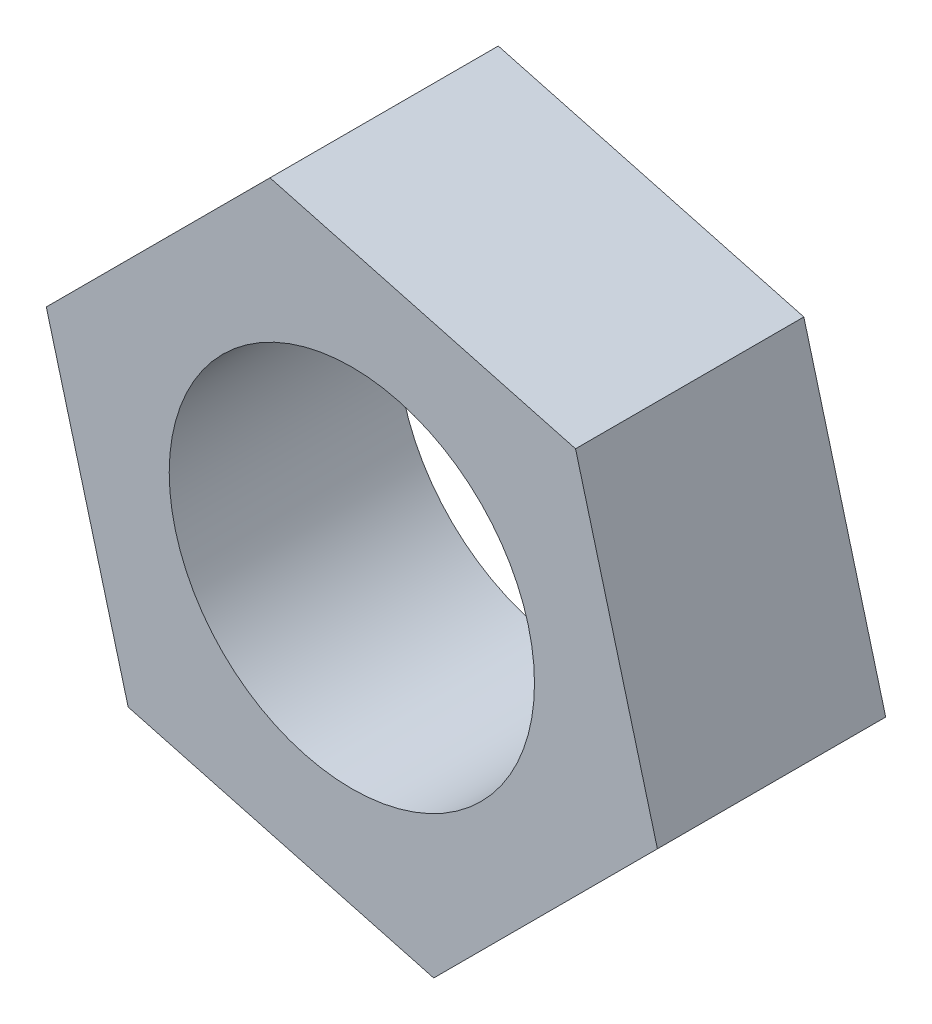
ISO-10303-21;
HEADER;
FILE_DESCRIPTION(('STEP AP214'),'2;1');
FILE_NAME('part.step','',(''),(''),'','','');
FILE_SCHEMA(('AUTOMOTIVE_DESIGN { 1 0 10303 214 1 1 1 1 }'));
ENDSEC;
DATA;
#1=APPLICATION_CONTEXT('core data for automotive mechanical design processes');
#2=APPLICATION_PROTOCOL_DEFINITION('international standard','automotive_design',2000,#1);
#3=PRODUCT_CONTEXT('',#1,'mechanical');
#4=PRODUCT('Part','Part','',(#3));
#5=PRODUCT_RELATED_PRODUCT_CATEGORY('part','',(#4));
#6=PRODUCT_DEFINITION_FORMATION('','',#4);
#7=PRODUCT_DEFINITION_CONTEXT('part definition',#1,'design');
#8=PRODUCT_DEFINITION('design','',#6,#7);
#9=PRODUCT_DEFINITION_SHAPE('','',#8);
#10=(LENGTH_UNIT() NAMED_UNIT(*) SI_UNIT(.MILLI.,.METRE.));
#11=(NAMED_UNIT(*) PLANE_ANGLE_UNIT() SI_UNIT($,.RADIAN.));
#12=(NAMED_UNIT(*) SI_UNIT($,.STERADIAN.) SOLID_ANGLE_UNIT());
#13=UNCERTAINTY_MEASURE_WITH_UNIT(LENGTH_MEASURE(1.E-05),#10,'distance_accuracy_value','');
#14=(GEOMETRIC_REPRESENTATION_CONTEXT(3) GLOBAL_UNCERTAINTY_ASSIGNED_CONTEXT((#13)) GLOBAL_UNIT_ASSIGNED_CONTEXT((#10,
#11,#12)) REPRESENTATION_CONTEXT('',''));
#15=CARTESIAN_POINT('',(0.,0.,0.));
#16=DIRECTION('',(0.,0.,1.));
#17=DIRECTION('',(1.,0.,0.));
#18=AXIS2_PLACEMENT_3D('',#15,#16,#17);
#19=CARTESIAN_POINT('',(0.,0.,5.));
#20=DIRECTION('',(0.,0.,1.));
#21=DIRECTION('',(1.,0.,0.));
#22=AXIS2_PLACEMENT_3D('',#19,#20,#21);
#23=PLANE('',#22);
#24=CARTESIAN_POINT('',(0.,0.,5.));
#25=DIRECTION('',(0.,0.,1.));
#26=DIRECTION('',(1.,0.,0.));
#27=AXIS2_PLACEMENT_3D('',#24,#25,#26);
#28=CIRCLE('',#27,4.);
#29=CARTESIAN_POINT('',(4.,0.,5.));
#30=VERTEX_POINT('',#29);
#31=EDGE_CURVE('E139',#30,#30,#28,.T.);
#32=ORIENTED_EDGE('',*,*,#31,.F.);
#33=EDGE_LOOP('',(#32));
#34=FACE_BOUND('',#33,.T.);
#35=DIRECTION('',(0.70711430388456,0.707099258408503,0.));
#36=VECTOR('',#35,1.);
#37=CARTESIAN_POINT('',(6.69211135256622,-1.79322214017613,5.));
#38=LINE('',#37,#36);
#39=CARTESIAN_POINT('',(1.79307974826223,-6.6921495063643,5.));
#40=VERTEX_POINT('',#39);
#41=CARTESIAN_POINT('',(6.69211135256622,-1.79322214017613,5.));
#42=VERTEX_POINT('',#41);
#43=EDGE_CURVE('E126',#40,#42,#38,.T.);
#44=ORIENTED_EDGE('',*,*,#43,.T.);
#45=DIRECTION('',(-0.25880876883662,0.96592857974763,0.));
#46=VECTOR('',#45,1.);
#47=CARTESIAN_POINT('',(4.89903160430447,4.89892736618804,5.));
#48=LINE('',#47,#46);
#49=CARTESIAN_POINT('',(4.89903160430447,4.89892736618804,5.));
#50=VERTEX_POINT('',#49);
#51=EDGE_CURVE('E87',#42,#50,#48,.T.);
#52=ORIENTED_EDGE('',*,*,#51,.T.);
#53=DIRECTION('',(-0.96592307272118,0.258829321339127,0.));
#54=VECTOR('',#53,1.);
#55=CARTESIAN_POINT('',(-1.79307974826127,6.69214950636405,5.));
#56=LINE('',#55,#54);
#57=CARTESIAN_POINT('',(-1.79307974826127,6.69214950636405,5.));
#58=VERTEX_POINT('',#57);
#59=EDGE_CURVE('E93',#50,#58,#56,.T.);
#60=ORIENTED_EDGE('',*,*,#59,.T.);
#61=DIRECTION('',(-0.70711430388456,-0.707099258408502,0.));
#62=VECTOR('',#61,1.);
#63=CARTESIAN_POINT('',(-6.69211135256526,1.79322214017588,5.));
#64=LINE('',#63,#62);
#65=CARTESIAN_POINT('',(-6.69211135256526,1.79322214017588,5.));
#66=VERTEX_POINT('',#65);
#67=EDGE_CURVE('E138',#58,#66,#64,.T.);
#68=ORIENTED_EDGE('',*,*,#67,.T.);
#69=DIRECTION('',(0.25880876883662,-0.96592857974763,0.));
#70=VECTOR('',#69,1.);
#71=CARTESIAN_POINT('',(-4.89903160430351,-4.8989273661883,5.));
#72=LINE('',#71,#70);
#73=CARTESIAN_POINT('',(-4.89903160430351,-4.8989273661883,5.));
#74=VERTEX_POINT('',#73);
#75=EDGE_CURVE('E142',#66,#74,#72,.T.);
#76=ORIENTED_EDGE('',*,*,#75,.T.);
#77=DIRECTION('',(0.965923072721181,-0.258829321339127,0.));
#78=VECTOR('',#77,1.);
#79=CARTESIAN_POINT('',(1.79307974826223,-6.6921495063643,5.));
#80=LINE('',#79,#78);
#81=EDGE_CURVE('E146',#74,#40,#80,.T.);
#82=ORIENTED_EDGE('',*,*,#81,.T.);
#83=EDGE_LOOP('',(#44,#52,#60,#68,#76,#82));
#84=FACE_BOUND('',#83,.T.);
#85=ADVANCED_FACE('F47',(#34,#84),#23,.T.);
#86=CARTESIAN_POINT('',(0.,0.,0.));
#87=DIRECTION('',(0.,0.,1.));
#88=DIRECTION('',(1.,0.,0.));
#89=AXIS2_PLACEMENT_3D('',#86,#87,#88);
#90=PLANE('',#89);
#91=CARTESIAN_POINT('',(0.,0.,0.));
#92=DIRECTION('',(0.,0.,-1.));
#93=DIRECTION('',(-1.,0.,0.));
#94=AXIS2_PLACEMENT_3D('',#91,#92,#93);
#95=CIRCLE('',#94,4.);
#96=CARTESIAN_POINT('',(-4.,0.,0.));
#97=VERTEX_POINT('',#96);
#98=EDGE_CURVE('E180',#97,#97,#95,.T.);
#99=ORIENTED_EDGE('',*,*,#98,.F.);
#100=EDGE_LOOP('',(#99));
#101=FACE_BOUND('',#100,.T.);
#102=DIRECTION('',(0.25880876883662,-0.96592857974763,0.));
#103=VECTOR('',#102,1.);
#104=CARTESIAN_POINT('',(-4.89903160430351,-4.8989273661883,0.));
#105=LINE('',#104,#103);
#106=CARTESIAN_POINT('',(-6.69211135256526,1.79322214017588,0.));
#107=VERTEX_POINT('',#106);
#108=CARTESIAN_POINT('',(-4.89903160430351,-4.8989273661883,0.));
#109=VERTEX_POINT('',#108);
#110=EDGE_CURVE('E121',#107,#109,#105,.T.);
#111=ORIENTED_EDGE('',*,*,#110,.F.);
#112=DIRECTION('',(-0.70711430388456,-0.707099258408502,0.));
#113=VECTOR('',#112,1.);
#114=CARTESIAN_POINT('',(-6.69211135256526,1.79322214017588,0.));
#115=LINE('',#114,#113);
#116=CARTESIAN_POINT('',(-1.79307974826127,6.69214950636405,0.));
#117=VERTEX_POINT('',#116);
#118=EDGE_CURVE('E171',#117,#107,#115,.T.);
#119=ORIENTED_EDGE('',*,*,#118,.F.);
#120=DIRECTION('',(-0.96592307272118,0.258829321339127,0.));
#121=VECTOR('',#120,1.);
#122=CARTESIAN_POINT('',(-1.79307974826127,6.69214950636405,0.));
#123=LINE('',#122,#121);
#124=CARTESIAN_POINT('',(4.89903160430447,4.89892736618804,0.));
#125=VERTEX_POINT('',#124);
#126=EDGE_CURVE('E98',#125,#117,#123,.T.);
#127=ORIENTED_EDGE('',*,*,#126,.F.);
#128=DIRECTION('',(-0.25880876883662,0.96592857974763,0.));
#129=VECTOR('',#128,1.);
#130=CARTESIAN_POINT('',(4.89903160430447,4.89892736618804,0.));
#131=LINE('',#130,#129);
#132=CARTESIAN_POINT('',(6.69211135256622,-1.79322214017613,0.));
#133=VERTEX_POINT('',#132);
#134=EDGE_CURVE('E66',#133,#125,#131,.T.);
#135=ORIENTED_EDGE('',*,*,#134,.F.);
#136=DIRECTION('',(0.70711430388456,0.707099258408503,0.));
#137=VECTOR('',#136,1.);
#138=CARTESIAN_POINT('',(6.69211135256622,-1.79322214017613,0.));
#139=LINE('',#138,#137);
#140=CARTESIAN_POINT('',(1.79307974826223,-6.6921495063643,0.));
#141=VERTEX_POINT('',#140);
#142=EDGE_CURVE('E120',#141,#133,#139,.T.);
#143=ORIENTED_EDGE('',*,*,#142,.F.);
#144=DIRECTION('',(0.965923072721181,-0.258829321339127,0.));
#145=VECTOR('',#144,1.);
#146=CARTESIAN_POINT('',(1.79307974826223,-6.6921495063643,0.));
#147=LINE('',#146,#145);
#148=EDGE_CURVE('E110',#109,#141,#147,.T.);
#149=ORIENTED_EDGE('',*,*,#148,.F.);
#150=EDGE_LOOP('',(#111,#119,#127,#135,#143,#149));
#151=FACE_BOUND('',#150,.T.);
#152=ADVANCED_FACE('F49',(#101,#151),#90,.F.);
#153=CARTESIAN_POINT('',(-1.79307974826127,6.69214950636405,0.));
#154=DIRECTION('',(0.258829321339127,0.96592307272118,0.));
#155=DIRECTION('',(-0.965923072721181,0.258829321339127,0.));
#156=AXIS2_PLACEMENT_3D('',#153,#154,#155);
#157=PLANE('',#156);
#158=ORIENTED_EDGE('',*,*,#126,.T.);
#159=DIRECTION('',(0.,0.,1.));
#160=VECTOR('',#159,1.);
#161=CARTESIAN_POINT('',(-1.79307974826127,6.69214950636405,0.));
#162=LINE('',#161,#160);
#163=EDGE_CURVE('E51',#117,#58,#162,.T.);
#164=ORIENTED_EDGE('',*,*,#163,.T.);
#165=ORIENTED_EDGE('',*,*,#59,.F.);
#166=DIRECTION('',(0.,0.,1.));
#167=VECTOR('',#166,1.);
#168=CARTESIAN_POINT('',(4.89903160430447,4.89892736618804,0.));
#169=LINE('',#168,#167);
#170=EDGE_CURVE('E11',#125,#50,#169,.T.);
#171=ORIENTED_EDGE('',*,*,#170,.F.);
#172=EDGE_LOOP('',(#158,#164,#165,#171));
#173=FACE_BOUND('',#172,.T.);
#174=ADVANCED_FACE('F163',(#173),#157,.T.);
#175=CARTESIAN_POINT('',(4.89903160430447,4.89892736618804,0.));
#176=DIRECTION('',(0.965928579747629,0.25880876883662,0.));
#177=DIRECTION('',(-0.258808768836621,0.96592857974763,0.));
#178=AXIS2_PLACEMENT_3D('',#175,#176,#177);
#179=PLANE('',#178);
#180=ORIENTED_EDGE('',*,*,#134,.T.);
#181=ORIENTED_EDGE('',*,*,#170,.T.);
#182=ORIENTED_EDGE('',*,*,#51,.F.);
#183=DIRECTION('',(0.,0.,1.));
#184=VECTOR('',#183,1.);
#185=CARTESIAN_POINT('',(6.69211135256622,-1.79322214017613,0.));
#186=LINE('',#185,#184);
#187=EDGE_CURVE('E58',#133,#42,#186,.T.);
#188=ORIENTED_EDGE('',*,*,#187,.F.);
#189=EDGE_LOOP('',(#180,#181,#182,#188));
#190=FACE_BOUND('',#189,.T.);
#191=ADVANCED_FACE('F193',(#190),#179,.T.);
#192=CARTESIAN_POINT('',(6.69211135256622,-1.79322214017613,0.));
#193=DIRECTION('',(0.707099258408502,-0.70711430388456,0.));
#194=DIRECTION('',(0.70711430388456,0.707099258408502,0.));
#195=AXIS2_PLACEMENT_3D('',#192,#193,#194);
#196=PLANE('',#195);
#197=ORIENTED_EDGE('',*,*,#142,.T.);
#198=ORIENTED_EDGE('',*,*,#187,.T.);
#199=ORIENTED_EDGE('',*,*,#43,.F.);
#200=DIRECTION('',(0.,0.,1.));
#201=VECTOR('',#200,1.);
#202=CARTESIAN_POINT('',(1.79307974826223,-6.6921495063643,0.));
#203=LINE('',#202,#201);
#204=EDGE_CURVE('E113',#141,#40,#203,.T.);
#205=ORIENTED_EDGE('',*,*,#204,.F.);
#206=EDGE_LOOP('',(#197,#198,#199,#205));
#207=FACE_BOUND('',#206,.T.);
#208=ADVANCED_FACE('F124',(#207),#196,.T.);
#209=CARTESIAN_POINT('',(1.79307974826223,-6.6921495063643,0.));
#210=DIRECTION('',(-0.258829321339127,-0.965923072721181,0.));
#211=DIRECTION('',(0.965923072721181,-0.258829321339127,0.));
#212=AXIS2_PLACEMENT_3D('',#209,#210,#211);
#213=PLANE('',#212);
#214=ORIENTED_EDGE('',*,*,#148,.T.);
#215=ORIENTED_EDGE('',*,*,#204,.T.);
#216=ORIENTED_EDGE('',*,*,#81,.F.);
#217=DIRECTION('',(0.,0.,1.));
#218=VECTOR('',#217,1.);
#219=CARTESIAN_POINT('',(-4.89903160430351,-4.8989273661883,0.));
#220=LINE('',#219,#218);
#221=EDGE_CURVE('E115',#109,#74,#220,.T.);
#222=ORIENTED_EDGE('',*,*,#221,.F.);
#223=EDGE_LOOP('',(#214,#215,#216,#222));
#224=FACE_BOUND('',#223,.T.);
#225=ADVANCED_FACE('F112',(#224),#213,.T.);
#226=CARTESIAN_POINT('',(-4.89903160430351,-4.8989273661883,0.));
#227=DIRECTION('',(-0.96592857974763,-0.25880876883662,0.));
#228=DIRECTION('',(0.25880876883662,-0.96592857974763,0.));
#229=AXIS2_PLACEMENT_3D('',#226,#227,#228);
#230=PLANE('',#229);
#231=ORIENTED_EDGE('',*,*,#110,.T.);
#232=ORIENTED_EDGE('',*,*,#221,.T.);
#233=ORIENTED_EDGE('',*,*,#75,.F.);
#234=DIRECTION('',(0.,0.,1.));
#235=VECTOR('',#234,1.);
#236=CARTESIAN_POINT('',(-6.69211135256526,1.79322214017588,0.));
#237=LINE('',#236,#235);
#238=EDGE_CURVE('E156',#107,#66,#237,.T.);
#239=ORIENTED_EDGE('',*,*,#238,.F.);
#240=EDGE_LOOP('',(#231,#232,#233,#239));
#241=FACE_BOUND('',#240,.T.);
#242=ADVANCED_FACE('F169',(#241),#230,.T.);
#243=CARTESIAN_POINT('',(-6.69211135256526,1.79322214017588,0.));
#244=DIRECTION('',(-0.707099258408502,0.70711430388456,0.));
#245=DIRECTION('',(-0.70711430388456,-0.707099258408502,0.));
#246=AXIS2_PLACEMENT_3D('',#243,#244,#245);
#247=PLANE('',#246);
#248=ORIENTED_EDGE('',*,*,#118,.T.);
#249=ORIENTED_EDGE('',*,*,#238,.T.);
#250=ORIENTED_EDGE('',*,*,#67,.F.);
#251=ORIENTED_EDGE('',*,*,#163,.F.);
#252=EDGE_LOOP('',(#248,#249,#250,#251));
#253=FACE_BOUND('',#252,.T.);
#254=ADVANCED_FACE('F165',(#253),#247,.T.);
#255=CARTESIAN_POINT('',(0.,0.,10.));
#256=DIRECTION('',(0.,0.,-1.));
#257=DIRECTION('',(-1.,0.,0.));
#258=AXIS2_PLACEMENT_3D('',#255,#256,#257);
#259=CYLINDRICAL_SURFACE('',#258,4.);
#260=ORIENTED_EDGE('',*,*,#31,.T.);
#261=EDGE_LOOP('',(#260));
#262=FACE_BOUND('',#261,.T.);
#263=ORIENTED_EDGE('',*,*,#98,.T.);
#264=EDGE_LOOP('',(#263));
#265=FACE_BOUND('',#264,.T.);
#266=ADVANCED_FACE('F185',(#262,#265),#259,.F.);
#267=CLOSED_SHELL('',(#85,#152,#174,#191,#208,#225,#242,#254,#266));
#268=MANIFOLD_SOLID_BREP('B2',#267);
#269=ADVANCED_BREP_SHAPE_REPRESENTATION('',(#18,#268),#14);
#270=SHAPE_DEFINITION_REPRESENTATION(#9,#269);
ENDSEC;
END-ISO-10303-21;
